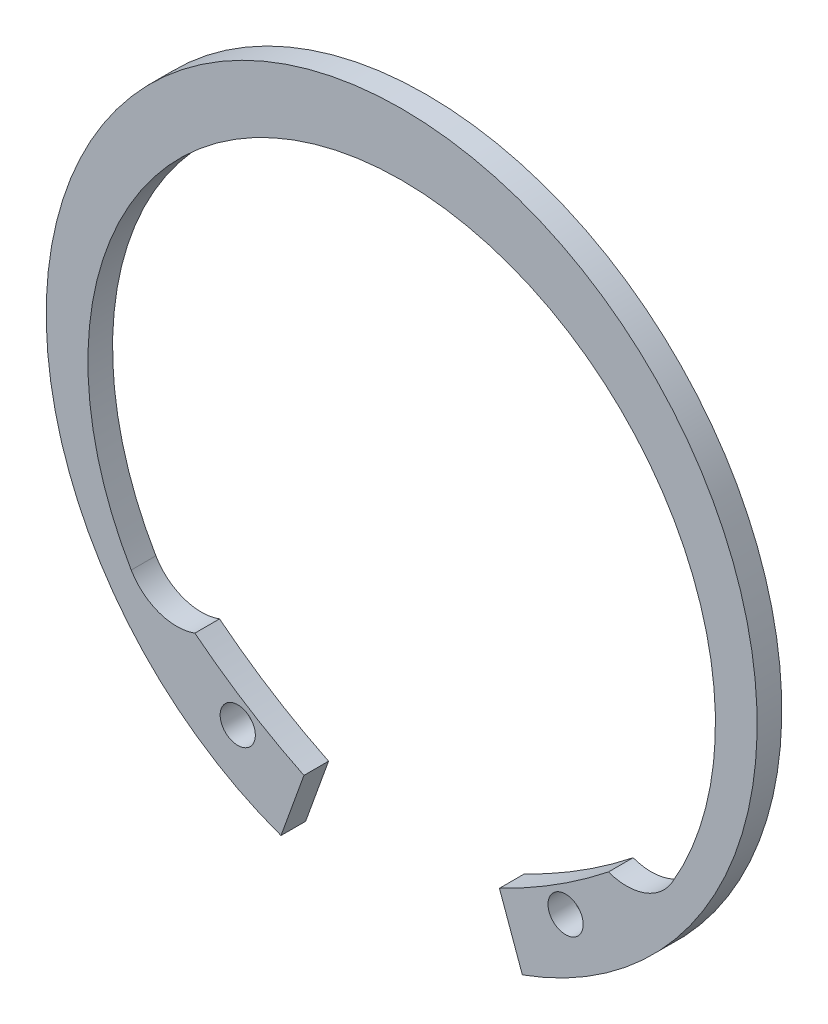
ISO-10303-21;
HEADER;
FILE_DESCRIPTION(('STEP AP214'),'2;1');
FILE_NAME('part.step','',(''),(''),'','','');
FILE_SCHEMA(('AUTOMOTIVE_DESIGN { 1 0 10303 214 1 1 1 1 }'));
ENDSEC;
DATA;
#1=APPLICATION_CONTEXT('core data for automotive mechanical design processes');
#2=APPLICATION_PROTOCOL_DEFINITION('international standard','automotive_design',2000,#1);
#3=PRODUCT_CONTEXT('',#1,'mechanical');
#4=PRODUCT('Part','Part','',(#3));
#5=PRODUCT_RELATED_PRODUCT_CATEGORY('part','',(#4));
#6=PRODUCT_DEFINITION_FORMATION('','',#4);
#7=PRODUCT_DEFINITION_CONTEXT('part definition',#1,'design');
#8=PRODUCT_DEFINITION('design','',#6,#7);
#9=PRODUCT_DEFINITION_SHAPE('','',#8);
#10=(LENGTH_UNIT() NAMED_UNIT(*) SI_UNIT(.MILLI.,.METRE.));
#11=(NAMED_UNIT(*) PLANE_ANGLE_UNIT() SI_UNIT($,.RADIAN.));
#12=(NAMED_UNIT(*) SI_UNIT($,.STERADIAN.) SOLID_ANGLE_UNIT());
#13=UNCERTAINTY_MEASURE_WITH_UNIT(LENGTH_MEASURE(1.E-05),#10,'distance_accuracy_value','');
#14=(GEOMETRIC_REPRESENTATION_CONTEXT(3) GLOBAL_UNCERTAINTY_ASSIGNED_CONTEXT((#13)) GLOBAL_UNIT_ASSIGNED_CONTEXT((#10,
#11,#12)) REPRESENTATION_CONTEXT('',''));
#15=CARTESIAN_POINT('',(0.,0.,0.));
#16=DIRECTION('',(0.,0.,1.));
#17=DIRECTION('',(1.,0.,0.));
#18=AXIS2_PLACEMENT_3D('',#15,#16,#17);
#19=CARTESIAN_POINT('',(0.,0.,-0.874999999999999));
#20=DIRECTION('',(0.,0.,-1.));
#21=DIRECTION('',(-1.,0.,0.));
#22=AXIS2_PLACEMENT_3D('',#19,#20,#21);
#23=PLANE('',#22);
#24=CARTESIAN_POINT('',(11.6444621675858,-18.4904299566357,-0.874999999999999));
#25=DIRECTION('',(0.,0.,1.));
#26=DIRECTION('',(-1.,0.,0.));
#27=AXIS2_PLACEMENT_3D('',#24,#25,#26);
#28=CIRCLE('',#27,1.25);
#29=CARTESIAN_POINT('',(10.3944621675858,-18.4904299566357,-0.874999999999999));
#30=VERTEX_POINT('',#29);
#31=EDGE_CURVE('E137',#30,#30,#28,.T.);
#32=ORIENTED_EDGE('',*,*,#31,.T.);
#33=EDGE_LOOP('',(#32));
#34=FACE_BOUND('',#33,.T.);
#35=CARTESIAN_POINT('',(-11.6444621675858,-18.4904299566358,-0.874999999999999));
#36=DIRECTION('',(0.,0.,1.));
#37=DIRECTION('',(1.,0.,0.));
#38=AXIS2_PLACEMENT_3D('',#35,#36,#37);
#39=CIRCLE('',#38,1.25);
#40=CARTESIAN_POINT('',(-10.3944621675858,-18.4904299566358,-0.874999999999999));
#41=VERTEX_POINT('',#40);
#42=EDGE_CURVE('E146',#41,#41,#39,.T.);
#43=ORIENTED_EDGE('',*,*,#42,.T.);
#44=EDGE_LOOP('',(#43));
#45=FACE_BOUND('',#44,.T.);
#46=DIRECTION('',(0.339522546419098,-0.940597916472863,0.));
#47=VECTOR('',#46,1.);
#48=CARTESIAN_POINT('',(8.57294429708224,-23.7500973909398,-0.874999999999999));
#49=LINE('',#48,#47);
#50=CARTESIAN_POINT('',(6.94323607427056,-19.2352273918701,-0.874999999999999));
#51=VERTEX_POINT('',#50);
#52=CARTESIAN_POINT('',(8.57294429708224,-23.7500973909398,-0.874999999999999));
#53=VERTEX_POINT('',#52);
#54=EDGE_CURVE('E167',#51,#53,#49,.T.);
#55=ORIENTED_EDGE('',*,*,#54,.F.);
#56=CARTESIAN_POINT('',(-11.4447116195082,18.552434048493,-0.874999999999999));
#57=DIRECTION('',(0.,0.,-1.));
#58=DIRECTION('',(-1.,0.,0.));
#59=AXIS2_PLACEMENT_3D('',#56,#57,#58);
#60=CIRCLE('',#59,42.024088062927);
#61=CARTESIAN_POINT('',(14.689323253184,-14.3570812744884,-0.874999999999999));
#62=VERTEX_POINT('',#61);
#63=EDGE_CURVE('E119',#62,#51,#60,.T.);
#64=ORIENTED_EDGE('',*,*,#63,.F.);
#65=CARTESIAN_POINT('',(15.9789115158841,-10.8357942778484,-0.874999999999999));
#66=DIRECTION('',(0.,0.,-1.));
#67=DIRECTION('',(-1.,0.,0.));
#68=AXIS2_PLACEMENT_3D('',#65,#66,#67);
#69=CIRCLE('',#68,3.75);
#70=CARTESIAN_POINT('',(19.2112821739769,-12.7369202412451,-0.874999999999999));
#71=VERTEX_POINT('',#70);
#72=EDGE_CURVE('E123',#71,#62,#69,.T.);
#73=ORIENTED_EDGE('',*,*,#72,.F.);
#74=CARTESIAN_POINT('',(0.,-1.43776207086411,-0.874999999999999));
#75=DIRECTION('',(0.,0.,-1.));
#76=DIRECTION('',(-1.,0.,0.));
#77=AXIS2_PLACEMENT_3D('',#74,#75,#76);
#78=CIRCLE('',#77,22.2877620708641);
#79=CARTESIAN_POINT('',(-19.2112821739768,-12.7369202412451,-0.874999999999999));
#80=VERTEX_POINT('',#79);
#81=EDGE_CURVE('E161',#80,#71,#78,.T.);
#82=ORIENTED_EDGE('',*,*,#81,.F.);
#83=CARTESIAN_POINT('',(-15.9789115158841,-10.8357942778484,-0.874999999999999));
#84=DIRECTION('',(0.,0.,-1.));
#85=DIRECTION('',(1.,0.,0.));
#86=AXIS2_PLACEMENT_3D('',#83,#84,#85);
#87=CIRCLE('',#86,3.75);
#88=CARTESIAN_POINT('',(-14.689323253184,-14.3570812744884,-0.874999999999999));
#89=VERTEX_POINT('',#88);
#90=EDGE_CURVE('E157',#89,#80,#87,.T.);
#91=ORIENTED_EDGE('',*,*,#90,.F.);
#92=CARTESIAN_POINT('',(11.4447116195082,18.552434048493,-0.874999999999999));
#93=DIRECTION('',(0.,0.,1.));
#94=DIRECTION('',(1.,0.,0.));
#95=AXIS2_PLACEMENT_3D('',#92,#93,#94);
#96=CIRCLE('',#95,42.024088062927);
#97=CARTESIAN_POINT('',(-6.94323607427056,-19.2352273918701,-0.874999999999999));
#98=VERTEX_POINT('',#97);
#99=EDGE_CURVE('E222',#89,#98,#96,.T.);
#100=ORIENTED_EDGE('',*,*,#99,.T.);
#101=DIRECTION('',(0.339522546419098,0.940597916472863,0.));
#102=VECTOR('',#101,1.);
#103=CARTESIAN_POINT('',(-8.57294429708222,-23.7500973909398,-0.874999999999999));
#104=LINE('',#103,#102);
#105=CARTESIAN_POINT('',(-8.57294429708222,-23.7500973909398,-0.874999999999999));
#106=VERTEX_POINT('',#105);
#107=EDGE_CURVE('E153',#106,#98,#104,.T.);
#108=ORIENTED_EDGE('',*,*,#107,.F.);
#109=CARTESIAN_POINT('',(0.,0.,-0.874999999999999));
#110=DIRECTION('',(0.,0.,1.));
#111=DIRECTION('',(-1.,0.,0.));
#112=AXIS2_PLACEMENT_3D('',#109,#110,#111);
#113=CIRCLE('',#112,25.25);
#114=EDGE_CURVE('E150',#53,#106,#113,.T.);
#115=ORIENTED_EDGE('',*,*,#114,.F.);
#116=EDGE_LOOP('',(#55,#64,#73,#82,#91,#100,#108,#115));
#117=FACE_BOUND('',#116,.T.);
#118=ADVANCED_FACE('F41',(#34,#45,#117),#23,.T.);
#119=CARTESIAN_POINT('',(0.,0.,0.875000000000001));
#120=DIRECTION('',(0.,0.,-1.));
#121=DIRECTION('',(-1.,0.,0.));
#122=AXIS2_PLACEMENT_3D('',#119,#120,#121);
#123=PLANE('',#122);
#124=CARTESIAN_POINT('',(11.6444621675858,-18.4904299566357,0.875000000000001));
#125=DIRECTION('',(0.,0.,1.));
#126=DIRECTION('',(-1.,0.,0.));
#127=AXIS2_PLACEMENT_3D('',#124,#125,#126);
#128=CIRCLE('',#127,1.25);
#129=CARTESIAN_POINT('',(10.3944621675858,-18.4904299566357,0.875000000000001));
#130=VERTEX_POINT('',#129);
#131=EDGE_CURVE('E203',#130,#130,#128,.T.);
#132=ORIENTED_EDGE('',*,*,#131,.F.);
#133=EDGE_LOOP('',(#132));
#134=FACE_BOUND('',#133,.T.);
#135=CARTESIAN_POINT('',(-11.6444621675858,-18.4904299566358,0.875000000000001));
#136=DIRECTION('',(0.,0.,1.));
#137=DIRECTION('',(1.,0.,0.));
#138=AXIS2_PLACEMENT_3D('',#135,#136,#137);
#139=CIRCLE('',#138,1.25);
#140=CARTESIAN_POINT('',(-10.3944621675858,-18.4904299566358,0.875000000000001));
#141=VERTEX_POINT('',#140);
#142=EDGE_CURVE('E198',#141,#141,#139,.T.);
#143=ORIENTED_EDGE('',*,*,#142,.F.);
#144=EDGE_LOOP('',(#143));
#145=FACE_BOUND('',#144,.T.);
#146=CARTESIAN_POINT('',(-11.4447116195082,18.552434048493,0.875000000000001));
#147=DIRECTION('',(0.,0.,-1.));
#148=DIRECTION('',(-1.,0.,0.));
#149=AXIS2_PLACEMENT_3D('',#146,#147,#148);
#150=CIRCLE('',#149,42.024088062927);
#151=CARTESIAN_POINT('',(14.689323253184,-14.3570812744884,0.875000000000001));
#152=VERTEX_POINT('',#151);
#153=CARTESIAN_POINT('',(6.94323607427057,-19.2352273918701,0.875000000000001));
#154=VERTEX_POINT('',#153);
#155=EDGE_CURVE('E108',#152,#154,#150,.T.);
#156=ORIENTED_EDGE('',*,*,#155,.T.);
#157=DIRECTION('',(0.339522546419098,-0.940597916472863,0.));
#158=VECTOR('',#157,1.);
#159=CARTESIAN_POINT('',(8.57294429708224,-23.7500973909398,0.875000000000001));
#160=LINE('',#159,#158);
#161=CARTESIAN_POINT('',(8.57294429708224,-23.7500973909398,0.875000000000001));
#162=VERTEX_POINT('',#161);
#163=EDGE_CURVE('E132',#154,#162,#160,.T.);
#164=ORIENTED_EDGE('',*,*,#163,.T.);
#165=CARTESIAN_POINT('',(0.,0.,0.875000000000001));
#166=DIRECTION('',(0.,0.,1.));
#167=DIRECTION('',(-1.,0.,0.));
#168=AXIS2_PLACEMENT_3D('',#165,#166,#167);
#169=CIRCLE('',#168,25.25);
#170=CARTESIAN_POINT('',(-8.57294429708222,-23.7500973909398,0.875000000000001));
#171=VERTEX_POINT('',#170);
#172=EDGE_CURVE('E190',#162,#171,#169,.T.);
#173=ORIENTED_EDGE('',*,*,#172,.T.);
#174=DIRECTION('',(0.339522546419098,0.940597916472863,0.));
#175=VECTOR('',#174,1.);
#176=CARTESIAN_POINT('',(-8.57294429708222,-23.7500973909398,0.875000000000001));
#177=LINE('',#176,#175);
#178=CARTESIAN_POINT('',(-6.94323607427056,-19.2352273918701,0.875000000000001));
#179=VERTEX_POINT('',#178);
#180=EDGE_CURVE('E192',#171,#179,#177,.T.);
#181=ORIENTED_EDGE('',*,*,#180,.T.);
#182=CARTESIAN_POINT('',(11.4447116195082,18.552434048493,0.875000000000001));
#183=DIRECTION('',(0.,0.,1.));
#184=DIRECTION('',(1.,0.,0.));
#185=AXIS2_PLACEMENT_3D('',#182,#183,#184);
#186=CIRCLE('',#185,42.024088062927);
#187=CARTESIAN_POINT('',(-14.689323253184,-14.3570812744884,0.875000000000001));
#188=VERTEX_POINT('',#187);
#189=EDGE_CURVE('E209',#188,#179,#186,.T.);
#190=ORIENTED_EDGE('',*,*,#189,.F.);
#191=CARTESIAN_POINT('',(-15.9789115158841,-10.8357942778484,0.875000000000001));
#192=DIRECTION('',(0.,0.,-1.));
#193=DIRECTION('',(1.,0.,0.));
#194=AXIS2_PLACEMENT_3D('',#191,#192,#193);
#195=CIRCLE('',#194,3.75);
#196=CARTESIAN_POINT('',(-19.2112821739768,-12.7369202412451,0.875000000000001));
#197=VERTEX_POINT('',#196);
#198=EDGE_CURVE('E139',#188,#197,#195,.T.);
#199=ORIENTED_EDGE('',*,*,#198,.T.);
#200=CARTESIAN_POINT('',(0.,-1.43776207086411,0.875000000000001));
#201=DIRECTION('',(0.,0.,-1.));
#202=DIRECTION('',(-1.,0.,0.));
#203=AXIS2_PLACEMENT_3D('',#200,#201,#202);
#204=CIRCLE('',#203,22.2877620708641);
#205=CARTESIAN_POINT('',(19.2112821739769,-12.7369202412451,0.875000000000001));
#206=VERTEX_POINT('',#205);
#207=EDGE_CURVE('E130',#197,#206,#204,.T.);
#208=ORIENTED_EDGE('',*,*,#207,.T.);
#209=CARTESIAN_POINT('',(15.9789115158841,-10.8357942778484,0.875000000000001));
#210=DIRECTION('',(0.,0.,-1.));
#211=DIRECTION('',(-1.,0.,0.));
#212=AXIS2_PLACEMENT_3D('',#209,#210,#211);
#213=CIRCLE('',#212,3.75);
#214=EDGE_CURVE('E122',#206,#152,#213,.T.);
#215=ORIENTED_EDGE('',*,*,#214,.T.);
#216=EDGE_LOOP('',(#156,#164,#173,#181,#190,#199,#208,#215));
#217=FACE_BOUND('',#216,.T.);
#218=ADVANCED_FACE('F127',(#134,#145,#217),#123,.F.);
#219=CARTESIAN_POINT('',(0.,0.,-0.874999999999999));
#220=DIRECTION('',(0.,0.,1.));
#221=DIRECTION('',(1.,0.,0.));
#222=AXIS2_PLACEMENT_3D('',#219,#220,#221);
#223=CYLINDRICAL_SURFACE('',#222,25.25);
#224=DIRECTION('',(0.,0.,1.));
#225=VECTOR('',#224,1.);
#226=CARTESIAN_POINT('',(-8.57294429708222,-23.7500973909398,-0.874999999999999));
#227=LINE('',#226,#225);
#228=EDGE_CURVE('E45',#106,#171,#227,.T.);
#229=ORIENTED_EDGE('',*,*,#228,.T.);
#230=ORIENTED_EDGE('',*,*,#172,.F.);
#231=DIRECTION('',(0.,0.,1.));
#232=VECTOR('',#231,1.);
#233=CARTESIAN_POINT('',(8.57294429708224,-23.7500973909398,-0.874999999999999));
#234=LINE('',#233,#232);
#235=EDGE_CURVE('E11',#53,#162,#234,.T.);
#236=ORIENTED_EDGE('',*,*,#235,.F.);
#237=ORIENTED_EDGE('',*,*,#114,.T.);
#238=EDGE_LOOP('',(#229,#230,#236,#237));
#239=FACE_BOUND('',#238,.T.);
#240=ADVANCED_FACE('F43',(#239),#223,.T.);
#241=CARTESIAN_POINT('',(8.57294429708224,-23.7500973909398,-0.874999999999999));
#242=DIRECTION('',(-0.940597916472863,-0.339522546419098,0.));
#243=DIRECTION('',(0.339522546419098,-0.940597916472863,0.));
#244=AXIS2_PLACEMENT_3D('',#241,#242,#243);
#245=PLANE('',#244);
#246=ORIENTED_EDGE('',*,*,#235,.T.);
#247=ORIENTED_EDGE('',*,*,#163,.F.);
#248=DIRECTION('',(0.,0.,1.));
#249=VECTOR('',#248,1.);
#250=CARTESIAN_POINT('',(6.94323607427057,-19.2352273918701,-0.874999999999999));
#251=LINE('',#250,#249);
#252=EDGE_CURVE('E51',#51,#154,#251,.T.);
#253=ORIENTED_EDGE('',*,*,#252,.F.);
#254=ORIENTED_EDGE('',*,*,#54,.T.);
#255=EDGE_LOOP('',(#246,#247,#253,#254));
#256=FACE_BOUND('',#255,.T.);
#257=ADVANCED_FACE('F234',(#256),#245,.T.);
#258=CARTESIAN_POINT('',(15.9789115158841,-10.8357942778484,-0.874999999999999));
#259=DIRECTION('',(0.,0.,1.));
#260=DIRECTION('',(1.,0.,0.));
#261=AXIS2_PLACEMENT_3D('',#258,#259,#260);
#262=CYLINDRICAL_SURFACE('',#261,3.75);
#263=DIRECTION('',(0.,0.,1.));
#264=VECTOR('',#263,1.);
#265=CARTESIAN_POINT('',(14.6893232531841,-14.3570812744884,-0.874999999999999));
#266=LINE('',#265,#264);
#267=EDGE_CURVE('E111',#62,#152,#266,.T.);
#268=ORIENTED_EDGE('',*,*,#267,.T.);
#269=ORIENTED_EDGE('',*,*,#214,.F.);
#270=DIRECTION('',(0.,0.,1.));
#271=VECTOR('',#270,1.);
#272=CARTESIAN_POINT('',(19.2112821739769,-12.7369202412451,-0.874999999999999));
#273=LINE('',#272,#271);
#274=EDGE_CURVE('E65',#71,#206,#273,.T.);
#275=ORIENTED_EDGE('',*,*,#274,.F.);
#276=ORIENTED_EDGE('',*,*,#72,.T.);
#277=EDGE_LOOP('',(#268,#269,#275,#276));
#278=FACE_BOUND('',#277,.T.);
#279=ADVANCED_FACE('F121',(#278),#262,.F.);
#280=CARTESIAN_POINT('',(0.,-1.43776207086411,-0.874999999999999));
#281=DIRECTION('',(0.,0.,1.));
#282=DIRECTION('',(1.,0.,0.));
#283=AXIS2_PLACEMENT_3D('',#280,#281,#282);
#284=CYLINDRICAL_SURFACE('',#283,22.2877620708641);
#285=ORIENTED_EDGE('',*,*,#274,.T.);
#286=ORIENTED_EDGE('',*,*,#207,.F.);
#287=DIRECTION('',(0.,0.,1.));
#288=VECTOR('',#287,1.);
#289=CARTESIAN_POINT('',(-19.2112821739768,-12.7369202412451,-0.874999999999999));
#290=LINE('',#289,#288);
#291=EDGE_CURVE('E175',#80,#197,#290,.T.);
#292=ORIENTED_EDGE('',*,*,#291,.F.);
#293=ORIENTED_EDGE('',*,*,#81,.T.);
#294=EDGE_LOOP('',(#285,#286,#292,#293));
#295=FACE_BOUND('',#294,.T.);
#296=ADVANCED_FACE('F213',(#295),#284,.F.);
#297=CARTESIAN_POINT('',(-15.9789115158841,-10.8357942778484,-0.874999999999999));
#298=DIRECTION('',(0.,0.,1.));
#299=DIRECTION('',(1.,0.,0.));
#300=AXIS2_PLACEMENT_3D('',#297,#298,#299);
#301=CYLINDRICAL_SURFACE('',#300,3.75);
#302=ORIENTED_EDGE('',*,*,#291,.T.);
#303=ORIENTED_EDGE('',*,*,#198,.F.);
#304=DIRECTION('',(0.,0.,1.));
#305=VECTOR('',#304,1.);
#306=CARTESIAN_POINT('',(-14.689323253184,-14.3570812744884,-0.874999999999999));
#307=LINE('',#306,#305);
#308=EDGE_CURVE('E178',#89,#188,#307,.T.);
#309=ORIENTED_EDGE('',*,*,#308,.F.);
#310=ORIENTED_EDGE('',*,*,#90,.T.);
#311=EDGE_LOOP('',(#302,#303,#309,#310));
#312=FACE_BOUND('',#311,.T.);
#313=ADVANCED_FACE('F219',(#312),#301,.F.);
#314=CARTESIAN_POINT('',(-8.57294429708222,-23.7500973909398,-0.874999999999999));
#315=DIRECTION('',(0.940597916472863,-0.339522546419098,0.));
#316=DIRECTION('',(0.339522546419098,0.940597916472863,0.));
#317=AXIS2_PLACEMENT_3D('',#314,#315,#316);
#318=PLANE('',#317);
#319=DIRECTION('',(0.,0.,1.));
#320=VECTOR('',#319,1.);
#321=CARTESIAN_POINT('',(-6.94323607427056,-19.2352273918701,-0.874999999999999));
#322=LINE('',#321,#320);
#323=EDGE_CURVE('E180',#98,#179,#322,.T.);
#324=ORIENTED_EDGE('',*,*,#323,.T.);
#325=ORIENTED_EDGE('',*,*,#180,.F.);
#326=ORIENTED_EDGE('',*,*,#228,.F.);
#327=ORIENTED_EDGE('',*,*,#107,.T.);
#328=EDGE_LOOP('',(#324,#325,#326,#327));
#329=FACE_BOUND('',#328,.T.);
#330=ADVANCED_FACE('F193',(#329),#318,.T.);
#331=CARTESIAN_POINT('',(-11.6444621675858,-18.4904299566358,-0.874999999999999));
#332=DIRECTION('',(0.,0.,1.));
#333=DIRECTION('',(1.,0.,0.));
#334=AXIS2_PLACEMENT_3D('',#331,#332,#333);
#335=CYLINDRICAL_SURFACE('',#334,1.25);
#336=ORIENTED_EDGE('',*,*,#42,.F.);
#337=EDGE_LOOP('',(#336));
#338=FACE_BOUND('',#337,.T.);
#339=ORIENTED_EDGE('',*,*,#142,.T.);
#340=EDGE_LOOP('',(#339));
#341=FACE_BOUND('',#340,.T.);
#342=ADVANCED_FACE('F252',(#338,#341),#335,.F.);
#343=CARTESIAN_POINT('',(11.6444621675858,-18.4904299566357,-0.874999999999999));
#344=DIRECTION('',(0.,0.,1.));
#345=DIRECTION('',(1.,0.,0.));
#346=AXIS2_PLACEMENT_3D('',#343,#344,#345);
#347=CYLINDRICAL_SURFACE('',#346,1.25);
#348=ORIENTED_EDGE('',*,*,#31,.F.);
#349=EDGE_LOOP('',(#348));
#350=FACE_BOUND('',#349,.T.);
#351=ORIENTED_EDGE('',*,*,#131,.T.);
#352=EDGE_LOOP('',(#351));
#353=FACE_BOUND('',#352,.T.);
#354=ADVANCED_FACE('F255',(#350,#353),#347,.F.);
#355=CARTESIAN_POINT('',(11.4447116195082,18.552434048493,-0.874999999999999));
#356=DIRECTION('',(0.,0.,1.));
#357=DIRECTION('',(1.,0.,0.));
#358=AXIS2_PLACEMENT_3D('',#355,#356,#357);
#359=CYLINDRICAL_SURFACE('',#358,42.024088062927);
#360=ORIENTED_EDGE('',*,*,#323,.F.);
#361=ORIENTED_EDGE('',*,*,#99,.F.);
#362=ORIENTED_EDGE('',*,*,#308,.T.);
#363=ORIENTED_EDGE('',*,*,#189,.T.);
#364=EDGE_LOOP('',(#360,#361,#362,#363));
#365=FACE_BOUND('',#364,.T.);
#366=ADVANCED_FACE('F221',(#365),#359,.F.);
#367=CARTESIAN_POINT('',(-11.4447116195082,18.552434048493,-0.874999999999999));
#368=DIRECTION('',(0.,0.,1.));
#369=DIRECTION('',(1.,0.,0.));
#370=AXIS2_PLACEMENT_3D('',#367,#368,#369);
#371=CYLINDRICAL_SURFACE('',#370,42.024088062927);
#372=ORIENTED_EDGE('',*,*,#267,.F.);
#373=ORIENTED_EDGE('',*,*,#63,.T.);
#374=ORIENTED_EDGE('',*,*,#252,.T.);
#375=ORIENTED_EDGE('',*,*,#155,.F.);
#376=EDGE_LOOP('',(#372,#373,#374,#375));
#377=FACE_BOUND('',#376,.T.);
#378=ADVANCED_FACE('F110',(#377),#371,.F.);
#379=CLOSED_SHELL('',(#118,#218,#240,#257,#279,#296,#313,#330,#342,#354,#366,#378));
#380=MANIFOLD_SOLID_BREP('B2',#379);
#381=ADVANCED_BREP_SHAPE_REPRESENTATION('',(#18,#380),#14);
#382=SHAPE_DEFINITION_REPRESENTATION(#9,#381);
ENDSEC;
END-ISO-10303-21;
